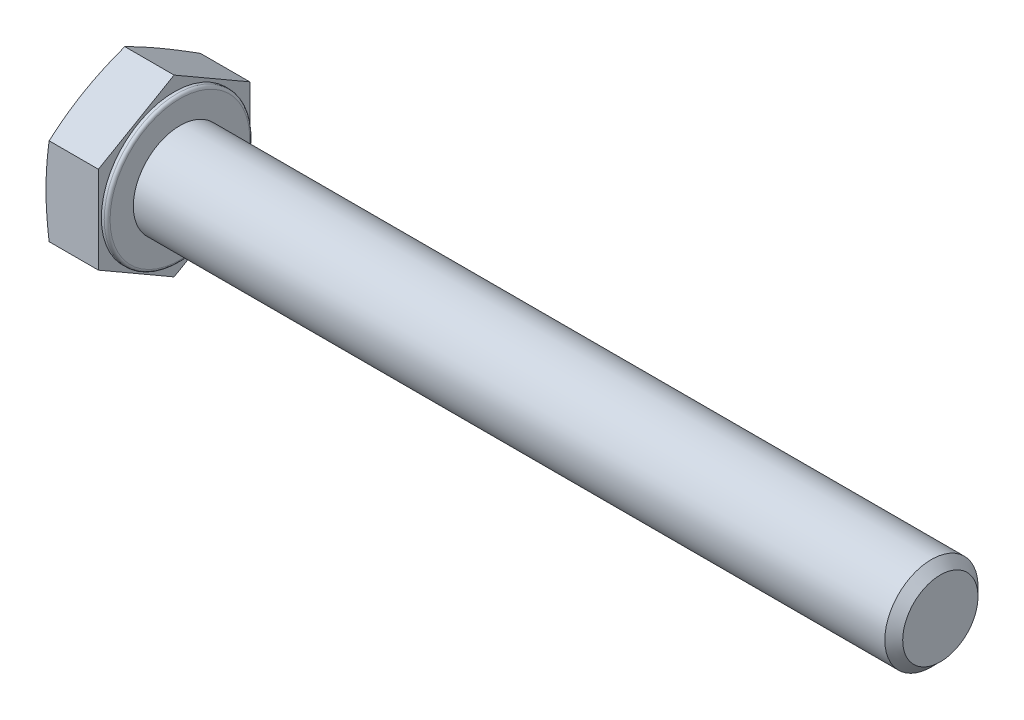
ISO-10303-21;
HEADER;
FILE_DESCRIPTION(('STEP AP214'),'2;1');
FILE_NAME('part.step','',(''),(''),'','','');
FILE_SCHEMA(('AUTOMOTIVE_DESIGN { 1 0 10303 214 1 1 1 1 }'));
ENDSEC;
DATA;
#1=APPLICATION_CONTEXT('core data for automotive mechanical design processes');
#2=APPLICATION_PROTOCOL_DEFINITION('international standard','automotive_design',2000,#1);
#3=PRODUCT_CONTEXT('',#1,'mechanical');
#4=PRODUCT('Part','Part','',(#3));
#5=PRODUCT_RELATED_PRODUCT_CATEGORY('part','',(#4));
#6=PRODUCT_DEFINITION_FORMATION('','',#4);
#7=PRODUCT_DEFINITION_CONTEXT('part definition',#1,'design');
#8=PRODUCT_DEFINITION('design','',#6,#7);
#9=PRODUCT_DEFINITION_SHAPE('','',#8);
#10=(LENGTH_UNIT() NAMED_UNIT(*) SI_UNIT(.MILLI.,.METRE.));
#11=(NAMED_UNIT(*) PLANE_ANGLE_UNIT() SI_UNIT($,.RADIAN.));
#12=(NAMED_UNIT(*) SI_UNIT($,.STERADIAN.) SOLID_ANGLE_UNIT());
#13=UNCERTAINTY_MEASURE_WITH_UNIT(LENGTH_MEASURE(1.E-05),#10,'distance_accuracy_value','');
#14=(GEOMETRIC_REPRESENTATION_CONTEXT(3) GLOBAL_UNCERTAINTY_ASSIGNED_CONTEXT((#13)) GLOBAL_UNIT_ASSIGNED_CONTEXT((#10,
#11,#12)) REPRESENTATION_CONTEXT('',''));
#15=CARTESIAN_POINT('',(0.,0.,0.));
#16=DIRECTION('',(0.,0.,1.));
#17=DIRECTION('',(1.,0.,0.));
#18=AXIS2_PLACEMENT_3D('',#15,#16,#17);
#19=CARTESIAN_POINT('',(4.49999999999999,7.8,0.));
#20=DIRECTION('',(-1.,0.,0.));
#21=DIRECTION('',(0.,0.,1.));
#22=AXIS2_PLACEMENT_3D('',#19,#20,#21);
#23=PLANE('',#22);
#24=DIRECTION('',(0.,0.5,0.866025403784439));
#25=VECTOR('',#24,1.);
#26=CARTESIAN_POINT('',(4.5,3.75277674973257,-6.5));
#27=LINE('',#26,#25);
#28=CARTESIAN_POINT('',(4.5,3.75277674973257,-6.5));
#29=VERTEX_POINT('',#28);
#30=CARTESIAN_POINT('',(4.49999999999999,7.50555349946513,0.));
#31=VERTEX_POINT('',#30);
#32=EDGE_CURVE('E132',#29,#31,#27,.T.);
#33=ORIENTED_EDGE('',*,*,#32,.T.);
#34=DIRECTION('',(0.,-0.5,0.866025403784439));
#35=VECTOR('',#34,1.);
#36=CARTESIAN_POINT('',(4.5,7.50555349946513,0.));
#37=LINE('',#36,#35);
#38=CARTESIAN_POINT('',(4.5,3.75277674973257,6.5));
#39=VERTEX_POINT('',#38);
#40=EDGE_CURVE('E63',#31,#39,#37,.T.);
#41=ORIENTED_EDGE('',*,*,#40,.T.);
#42=DIRECTION('',(0.,-1.,0.));
#43=VECTOR('',#42,1.);
#44=CARTESIAN_POINT('',(4.5,3.75277674973257,6.5));
#45=LINE('',#44,#43);
#46=CARTESIAN_POINT('',(4.5,-3.75277674973257,6.5));
#47=VERTEX_POINT('',#46);
#48=EDGE_CURVE('E121',#39,#47,#45,.T.);
#49=ORIENTED_EDGE('',*,*,#48,.T.);
#50=DIRECTION('',(0.,-0.5,-0.866025403784439));
#51=VECTOR('',#50,1.);
#52=CARTESIAN_POINT('',(4.5,-3.75277674973257,6.5));
#53=LINE('',#52,#51);
#54=CARTESIAN_POINT('',(4.5,-7.50555349946513,0.));
#55=VERTEX_POINT('',#54);
#56=EDGE_CURVE('E127',#47,#55,#53,.T.);
#57=ORIENTED_EDGE('',*,*,#56,.T.);
#58=DIRECTION('',(0.,0.5,-0.866025403784439));
#59=VECTOR('',#58,1.);
#60=CARTESIAN_POINT('',(4.5,-7.50555349946513,0.));
#61=LINE('',#60,#59);
#62=CARTESIAN_POINT('',(4.5,-3.75277674973257,-6.5));
#63=VERTEX_POINT('',#62);
#64=EDGE_CURVE('E136',#55,#63,#61,.T.);
#65=ORIENTED_EDGE('',*,*,#64,.T.);
#66=DIRECTION('',(0.,1.,0.));
#67=VECTOR('',#66,1.);
#68=CARTESIAN_POINT('',(4.5,-3.75277674973257,-6.5));
#69=LINE('',#68,#67);
#70=EDGE_CURVE('E139',#63,#29,#69,.T.);
#71=ORIENTED_EDGE('',*,*,#70,.T.);
#72=EDGE_LOOP('',(#33,#41,#49,#57,#65,#71));
#73=FACE_BOUND('',#72,.T.);
#74=CARTESIAN_POINT('',(4.49999999999999,0.,0.));
#75=DIRECTION('',(-1.,0.,0.));
#76=DIRECTION('',(0.,0.,1.));
#77=AXIS2_PLACEMENT_3D('',#74,#75,#76);
#78=CIRCLE('',#77,6.25);
#79=CARTESIAN_POINT('',(4.49999999999999,0.,6.25));
#80=VERTEX_POINT('',#79);
#81=EDGE_CURVE('E451',#80,#80,#78,.T.);
#82=ORIENTED_EDGE('',*,*,#81,.T.);
#83=EDGE_LOOP('',(#82));
#84=FACE_BOUND('',#83,.T.);
#85=ADVANCED_FACE('F39',(#73,#84),#23,.F.);
#86=CARTESIAN_POINT('',(70.3,0.,0.));
#87=DIRECTION('',(-1.,0.,0.));
#88=DIRECTION('',(0.,0.,1.));
#89=AXIS2_PLACEMENT_3D('',#86,#87,#88);
#90=CYLINDRICAL_SURFACE('',#89,6.25);
#91=ORIENTED_EDGE('',*,*,#81,.F.);
#92=EDGE_LOOP('',(#91));
#93=FACE_BOUND('',#92,.T.);
#94=CARTESIAN_POINT('',(4.74999999999999,0.,0.));
#95=DIRECTION('',(-1.,0.,0.));
#96=DIRECTION('',(0.,0.,1.));
#97=AXIS2_PLACEMENT_3D('',#94,#95,#96);
#98=CIRCLE('',#97,6.25);
#99=CARTESIAN_POINT('',(4.74999999999999,0.,6.25));
#100=VERTEX_POINT('',#99);
#101=EDGE_CURVE('E453',#100,#100,#98,.T.);
#102=ORIENTED_EDGE('',*,*,#101,.T.);
#103=EDGE_LOOP('',(#102));
#104=FACE_BOUND('',#103,.T.);
#105=ADVANCED_FACE('F236',(#93,#104),#90,.T.);
#106=CARTESIAN_POINT('',(4.74999999999999,0.,0.));
#107=DIRECTION('',(-1.,0.,0.));
#108=DIRECTION('',(0.,0.,1.));
#109=AXIS2_PLACEMENT_3D('',#106,#107,#108);
#110=TOROIDAL_SURFACE('',#109,6.,0.250000000000001);
#111=ORIENTED_EDGE('',*,*,#101,.F.);
#112=EDGE_LOOP('',(#111));
#113=FACE_BOUND('',#112,.T.);
#114=CARTESIAN_POINT('',(4.99999999999999,0.,0.));
#115=DIRECTION('',(-1.,0.,0.));
#116=DIRECTION('',(0.,0.,1.));
#117=AXIS2_PLACEMENT_3D('',#114,#115,#116);
#118=CIRCLE('',#117,6.);
#119=CARTESIAN_POINT('',(4.99999999999999,0.,6.));
#120=VERTEX_POINT('',#119);
#121=EDGE_CURVE('E456',#120,#120,#118,.T.);
#122=ORIENTED_EDGE('',*,*,#121,.T.);
#123=EDGE_LOOP('',(#122));
#124=FACE_BOUND('',#123,.T.);
#125=ADVANCED_FACE('F232',(#113,#124),#110,.T.);
#126=CARTESIAN_POINT('',(4.99999999999999,6.,0.));
#127=DIRECTION('',(-1.,0.,0.));
#128=DIRECTION('',(0.,0.,1.));
#129=AXIS2_PLACEMENT_3D('',#126,#127,#128);
#130=PLANE('',#129);
#131=ORIENTED_EDGE('',*,*,#121,.F.);
#132=EDGE_LOOP('',(#131));
#133=FACE_BOUND('',#132,.T.);
#134=CARTESIAN_POINT('',(4.99999999999999,0.,0.));
#135=DIRECTION('',(-1.,0.,0.));
#136=DIRECTION('',(0.,0.,1.));
#137=AXIS2_PLACEMENT_3D('',#134,#135,#136);
#138=CIRCLE('',#137,4.);
#139=CARTESIAN_POINT('',(4.99999999999999,0.,4.));
#140=VERTEX_POINT('',#139);
#141=EDGE_CURVE('E461',#140,#140,#138,.T.);
#142=ORIENTED_EDGE('',*,*,#141,.T.);
#143=EDGE_LOOP('',(#142));
#144=FACE_BOUND('',#143,.T.);
#145=ADVANCED_FACE('F228',(#133,#144),#130,.F.);
#146=CARTESIAN_POINT('',(70.3,0.,0.));
#147=DIRECTION('',(-1.,0.,0.));
#148=DIRECTION('',(0.,0.,1.));
#149=AXIS2_PLACEMENT_3D('',#146,#147,#148);
#150=CYLINDRICAL_SURFACE('',#149,4.);
#151=ORIENTED_EDGE('',*,*,#141,.F.);
#152=EDGE_LOOP('',(#151));
#153=FACE_BOUND('',#152,.T.);
#154=CARTESIAN_POINT('',(69.533,0.,0.));
#155=DIRECTION('',(-1.,0.,0.));
#156=DIRECTION('',(0.,0.,1.));
#157=AXIS2_PLACEMENT_3D('',#154,#155,#156);
#158=CIRCLE('',#157,4.);
#159=CARTESIAN_POINT('',(69.533,0.,4.));
#160=VERTEX_POINT('',#159);
#161=EDGE_CURVE('E449',#160,#160,#158,.T.);
#162=ORIENTED_EDGE('',*,*,#161,.T.);
#163=EDGE_LOOP('',(#162));
#164=FACE_BOUND('',#163,.T.);
#165=ADVANCED_FACE('F224',(#153,#164),#150,.T.);
#166=CARTESIAN_POINT('',(70.3,0.,0.));
#167=DIRECTION('',(-1.,0.,0.));
#168=DIRECTION('',(0.,0.,1.));
#169=AXIS2_PLACEMENT_3D('',#166,#167,#168);
#170=CONICAL_SURFACE('',#169,3.233,0.785398163397455);
#171=ORIENTED_EDGE('',*,*,#161,.F.);
#172=EDGE_LOOP('',(#171));
#173=FACE_BOUND('',#172,.T.);
#174=CARTESIAN_POINT('',(70.3,0.,0.));
#175=DIRECTION('',(-1.,0.,0.));
#176=DIRECTION('',(0.,0.,1.));
#177=AXIS2_PLACEMENT_3D('',#174,#175,#176);
#178=CIRCLE('',#177,3.233);
#179=CARTESIAN_POINT('',(70.3,0.,3.233));
#180=VERTEX_POINT('',#179);
#181=EDGE_CURVE('E447',#180,#180,#178,.T.);
#182=ORIENTED_EDGE('',*,*,#181,.T.);
#183=EDGE_LOOP('',(#182));
#184=FACE_BOUND('',#183,.T.);
#185=ADVANCED_FACE('F220',(#173,#184),#170,.T.);
#186=CARTESIAN_POINT('',(70.3,3.233,0.));
#187=DIRECTION('',(-1.,0.,0.));
#188=DIRECTION('',(0.,0.,1.));
#189=AXIS2_PLACEMENT_3D('',#186,#187,#188);
#190=PLANE('',#189);
#191=ORIENTED_EDGE('',*,*,#181,.F.);
#192=EDGE_LOOP('',(#191));
#193=FACE_BOUND('',#192,.T.);
#194=ADVANCED_FACE('F217',(#193),#190,.F.);
#195=CARTESIAN_POINT('',(4.5,7.50555349946513,0.));
#196=DIRECTION('',(0.,-0.866025403784439,-0.5));
#197=DIRECTION('',(0.,0.5,-0.866025403784439));
#198=AXIS2_PLACEMENT_3D('',#195,#196,#197);
#199=PLANE('',#198);
#200=DIRECTION('',(-1.,0.,0.));
#201=VECTOR('',#200,1.);
#202=CARTESIAN_POINT('',(4.5,3.75277674973257,6.5));
#203=LINE('',#202,#201);
#204=CARTESIAN_POINT('',(0.26943724812797,3.75277674973257,6.5));
#205=VERTEX_POINT('',#204);
#206=EDGE_CURVE('E110',#39,#205,#203,.T.);
#207=ORIENTED_EDGE('',*,*,#206,.F.);
#208=ORIENTED_EDGE('',*,*,#40,.F.);
#209=DIRECTION('',(-1.,0.,0.));
#210=VECTOR('',#209,1.);
#211=CARTESIAN_POINT('',(4.5,7.50555349946513,0.));
#212=LINE('',#211,#210);
#213=CARTESIAN_POINT('',(0.26943724812797,7.50555349946513,0.));
#214=VERTEX_POINT('',#213);
#215=EDGE_CURVE('E142',#31,#214,#212,.T.);
#216=ORIENTED_EDGE('',*,*,#215,.T.);
#217=CARTESIAN_POINT('',(0.269468188949637,3.75266127967873,6.5002));
#218=CARTESIAN_POINT('',(0.227689786895018,3.90851423871768,6.23025475643459));
#219=CARTESIAN_POINT('',(0.189761881028522,4.06464977836662,5.95982006889544));
#220=CARTESIAN_POINT('',(0.123126093519188,4.37747226630247,5.41799562604044));
#221=CARTESIAN_POINT('',(0.0944219569274198,4.53415941251653,5.14660552790472));
#222=CARTESIAN_POINT('',(0.0479094472750829,4.84713511167572,4.60451571542661));
#223=CARTESIAN_POINT('',(0.0300456056743191,5.00342154824672,4.33381966675176));
#224=CARTESIAN_POINT('',(0.00609202106019498,5.31619372769604,3.79208236075147));
#225=CARTESIAN_POINT('',(0.,5.47267942614745,3.52104118037574));
#226=CARTESIAN_POINT('',(0.,5.78565082305026,2.97895881962426));
#227=CARTESIAN_POINT('',(0.00609202106019492,5.94213652150166,2.70791763924853));
#228=CARTESIAN_POINT('',(0.030045605674319,6.25490870095099,2.16618033324825));
#229=CARTESIAN_POINT('',(0.0479094472750828,6.41119513752198,1.89548428457339));
#230=CARTESIAN_POINT('',(0.0944219569274197,6.72417083668118,1.35339447209528));
#231=CARTESIAN_POINT('',(0.123126093519188,6.88085798289523,1.08200437395956));
#232=CARTESIAN_POINT('',(0.189761881028522,7.19368047083108,0.540179931104565));
#233=CARTESIAN_POINT('',(0.227689786895017,7.34981601048003,0.269745243565408));
#234=CARTESIAN_POINT('',(0.269468188949637,7.50566896951897,-0.000199999999999693));
#235=B_SPLINE_CURVE_WITH_KNOTS('',3,(#217,#218,#219,#220,#221,#222,#223,#224,#225,#226,#227,
#228,#229,#230,#231,#232,#233,#234),.UNSPECIFIED.,.F.,.F.,(4,2,2,2,2,2,2,2,4),(0.,
0.943529232034515,1.88744107483688,2.82648138276556,3.76533995226988,4.70419852177419,
5.64323882970287,6.58715067250524,7.53067990453975),.UNSPECIFIED.);
#236=CARTESIAN_POINT('',(0.,5.62916512459885,3.25));
#237=VERTEX_POINT('',#236);
#238=EDGE_CURVE('E206',#237,#214,#235,.T.);
#239=ORIENTED_EDGE('',*,*,#238,.F.);
#240=EDGE_CURVE('E114',#205,#237,#235,.T.);
#241=ORIENTED_EDGE('',*,*,#240,.F.);
#242=EDGE_LOOP('',(#207,#208,#216,#239,#241));
#243=FACE_BOUND('',#242,.T.);
#244=ADVANCED_FACE('F112',(#243),#199,.F.);
#245=CARTESIAN_POINT('',(4.5,3.75277674973257,6.5));
#246=DIRECTION('',(0.,0.,-1.));
#247=DIRECTION('',(-1.,0.,0.));
#248=AXIS2_PLACEMENT_3D('',#245,#246,#247);
#249=PLANE('',#248);
#250=DIRECTION('',(-1.,0.,0.));
#251=VECTOR('',#250,1.);
#252=CARTESIAN_POINT('',(4.5,-3.75277674973257,6.5));
#253=LINE('',#252,#251);
#254=CARTESIAN_POINT('',(0.26943724812797,-3.75277674973257,6.5));
#255=VERTEX_POINT('',#254);
#256=EDGE_CURVE('E118',#47,#255,#253,.T.);
#257=ORIENTED_EDGE('',*,*,#256,.F.);
#258=ORIENTED_EDGE('',*,*,#48,.F.);
#259=ORIENTED_EDGE('',*,*,#206,.T.);
#260=CARTESIAN_POINT('',(1.43784813571386,-9.92747995942932,6.5));
#261=CARTESIAN_POINT('',(1.37176044607534,-9.63259364027998,6.5));
#262=CARTESIAN_POINT('',(1.30648101190795,-9.3375228790065,6.5));
#263=CARTESIAN_POINT('',(1.17797493100926,-8.74692189012471,6.5));
#264=CARTESIAN_POINT('',(1.1147483729357,-8.45139164324858,6.5));
#265=CARTESIAN_POINT('',(0.990729298823789,-7.85951636714962,6.5));
#266=CARTESIAN_POINT('',(0.929939231295713,-7.56317082304419,6.5));
#267=CARTESIAN_POINT('',(0.811449301164637,-6.96986292000732,6.5));
#268=CARTESIAN_POINT('',(0.753749412480938,-6.67290056630365,6.5));
#269=CARTESIAN_POINT('',(0.642620385559351,-6.08062010164735,6.5));
#270=CARTESIAN_POINT('',(0.589160917961816,-5.78530770946897,6.5));
#271=CARTESIAN_POINT('',(0.486909258203032,-5.19387740306857,6.5));
#272=CARTESIAN_POINT('',(0.438116963343878,-4.89775950671863,6.5));
#273=CARTESIAN_POINT('',(0.346298254295136,-4.30466070819224,6.5));
#274=CARTESIAN_POINT('',(0.303271130290397,-4.00767991686507,6.5));
#275=CARTESIAN_POINT('',(0.224250701875666,-3.4127732827379,6.5));
#276=CARTESIAN_POINT('',(0.188257404055355,-3.1148474390528,6.5));
#277=CARTESIAN_POINT('',(0.124323829115841,-2.51468954348012,6.5));
#278=CARTESIAN_POINT('',(0.0964798780072207,-2.21244707560578,6.5));
#279=CARTESIAN_POINT('',(0.0507658275086469,-1.60720229766205,6.5));
#280=CARTESIAN_POINT('',(0.0328954993834365,-1.30420000517859,6.5));
#281=CARTESIAN_POINT('',(0.00817096446973431,-0.697875110667414,6.5));
#282=CARTESIAN_POINT('',(0.00131175154307772,-0.394552716974275,6.5));
#283=CARTESIAN_POINT('',(-0.000968834974519462,0.212135691107176,6.5));
#284=CARTESIAN_POINT('',(0.00360978157467533,0.51550170545766,6.5));
#285=CARTESIAN_POINT('',(0.0239473685237663,1.12295501106408,6.5));
#286=CARTESIAN_POINT('',(0.0397469168421473,1.42704091600701,6.5));
#287=CARTESIAN_POINT('',(0.0816245049781679,2.03449758673866,6.5));
#288=CARTESIAN_POINT('',(0.107702772356124,2.33786833654499,6.5));
#289=CARTESIAN_POINT('',(0.168820504082469,2.94389214539338,6.5));
#290=CARTESIAN_POINT('',(0.203865816554221,3.24654460547712,6.5));
#291=CARTESIAN_POINT('',(0.281459381215648,3.85087551166636,6.5));
#292=CARTESIAN_POINT('',(0.324007656961857,4.15255395471078,6.5));
#293=CARTESIAN_POINT('',(0.412225361056411,4.73502363900967,6.5));
#294=CARTESIAN_POINT('',(0.457501487645549,5.01587505465996,6.5));
#295=CARTESIAN_POINT('',(0.552448562565194,5.57683763977975,6.5));
#296=CARTESIAN_POINT('',(0.602119630799358,5.85694878883832,6.5));
#297=CARTESIAN_POINT('',(0.705052527737279,6.41653333043442,6.5));
#298=CARTESIAN_POINT('',(0.75831467822402,6.69600666349383,6.5));
#299=CARTESIAN_POINT('',(0.867774180949243,7.25437933209811,6.5));
#300=CARTESIAN_POINT('',(0.923971571217232,7.53327866015738,6.5));
#301=CARTESIAN_POINT('',(1.09616917202687,8.36936246055762,6.5));
#302=CARTESIAN_POINT('',(1.21575141849974,8.92580841919927,6.5));
#303=CARTESIAN_POINT('',(1.46138948338771,10.037220527486,6.5));
#304=CARTESIAN_POINT('',(1.58744492312537,10.5921867617006,6.5));
#305=CARTESIAN_POINT('',(1.84285510364484,11.6956125673175,6.5));
#306=CARTESIAN_POINT('',(1.97216525218087,12.2440824890452,6.5));
#307=CARTESIAN_POINT('',(2.23402288841482,13.3402571674654,6.5));
#308=CARTESIAN_POINT('',(2.36657043508951,13.887961910026,6.5));
#309=CARTESIAN_POINT('',(2.63389242751176,14.9821103075548,6.5));
#310=CARTESIAN_POINT('',(2.76866392335456,15.528554684682,6.5));
#311=CARTESIAN_POINT('',(3.04004719024968,16.6209674516511,6.5));
#312=CARTESIAN_POINT('',(3.17665890042425,17.166935856606,6.5));
#313=CARTESIAN_POINT('',(3.31392230844987,17.7127383693738,6.5));
#314=B_SPLINE_CURVE_WITH_KNOTS('',3,(#260,#261,#262,#263,#264,#265,#266,#267,#268,#269,#270,
#271,#272,#273,#274,#275,#276,#277,#278,#279,#280,#281,#282,#283,#284,#285,#286,#287,#288,#289,
#290,#291,#292,#293,#294,#295,#296,#297,#298,#299,#300,#301,#302,#303,#304,#305,#306,#307,#308,
#309,#310,#311,#312,#313),.UNSPECIFIED.,.F.,.F.,(4,2,2,2,2,2,2,2,2,2,2,2,2,2,2,2,2,2,2,2,2,2,2,
2,2,2,4),(0.,0.906607084598815,1.8132532709792,2.72078883058254,3.62831672949855,
4.52862337467704,5.42891020467153,6.32908608815495,7.2292628149694,8.13968571853475,
9.05008774158607,9.96007573841703,10.8700629508024,11.7833577896006,12.6966728489474,
13.6105850787011,14.5245001778528,15.3778915312334,16.2313061741867,17.084797390217,
17.9382996669808,19.6456836970312,21.3529679597985,23.0434756712189,24.7340142022029,
26.4224665598404,28.1108631968051),.UNSPECIFIED.);
#315=CARTESIAN_POINT('',(0.,0.,6.5));
#316=VERTEX_POINT('',#315);
#317=EDGE_CURVE('E200',#316,#205,#314,.T.);
#318=ORIENTED_EDGE('',*,*,#317,.F.);
#319=EDGE_CURVE('E205',#255,#316,#314,.T.);
#320=ORIENTED_EDGE('',*,*,#319,.F.);
#321=EDGE_LOOP('',(#257,#258,#259,#318,#320));
#322=FACE_BOUND('',#321,.T.);
#323=ADVANCED_FACE('F122',(#322),#249,.F.);
#324=CARTESIAN_POINT('',(4.5,-3.75277674973257,6.5));
#325=DIRECTION('',(0.,0.866025403784439,-0.5));
#326=DIRECTION('',(0.,0.5,0.866025403784439));
#327=AXIS2_PLACEMENT_3D('',#324,#325,#326);
#328=PLANE('',#327);
#329=DIRECTION('',(-1.,0.,0.));
#330=VECTOR('',#329,1.);
#331=CARTESIAN_POINT('',(4.5,-7.50555349946513,0.));
#332=LINE('',#331,#330);
#333=CARTESIAN_POINT('',(0.26943724812797,-7.50555349946513,0.));
#334=VERTEX_POINT('',#333);
#335=EDGE_CURVE('E148',#55,#334,#332,.T.);
#336=ORIENTED_EDGE('',*,*,#335,.F.);
#337=ORIENTED_EDGE('',*,*,#56,.F.);
#338=ORIENTED_EDGE('',*,*,#256,.T.);
#339=CARTESIAN_POINT('',(0.269468188949637,-7.50566896951897,-0.0002));
#340=CARTESIAN_POINT('',(0.227689786895017,-7.34981601048003,0.269745243565409));
#341=CARTESIAN_POINT('',(0.189761881028522,-7.19368047083108,0.540179931104566));
#342=CARTESIAN_POINT('',(0.123126093519188,-6.88085798289523,1.08200437395956));
#343=CARTESIAN_POINT('',(0.0944219569274196,-6.72417083668117,1.35339447209528));
#344=CARTESIAN_POINT('',(0.0479094472750826,-6.41119513752198,1.89548428457339));
#345=CARTESIAN_POINT('',(0.0300456056743188,-6.25490870095099,2.16618033324825));
#346=CARTESIAN_POINT('',(0.00609202106019463,-5.94213652150166,2.70791763924853));
#347=CARTESIAN_POINT('',(0.,-5.78565082305026,2.97895881962427));
#348=CARTESIAN_POINT('',(0.,-5.47267942614745,3.52104118037574));
#349=CARTESIAN_POINT('',(0.00609202106019497,-5.31619372769604,3.79208236075147));
#350=CARTESIAN_POINT('',(0.0300456056743193,-5.00342154824672,4.33381966675176));
#351=CARTESIAN_POINT('',(0.047909447275083,-4.84713511167572,4.60451571542661));
#352=CARTESIAN_POINT('',(0.0944219569274199,-4.53415941251653,5.14660552790473));
#353=CARTESIAN_POINT('',(0.123126093519188,-4.37747226630247,5.41799562604044));
#354=CARTESIAN_POINT('',(0.189761881028522,-4.06464977836662,5.95982006889544));
#355=CARTESIAN_POINT('',(0.227689786895018,-3.90851423871768,6.23025475643459));
#356=CARTESIAN_POINT('',(0.269468188949638,-3.75266127967873,6.5002));
#357=B_SPLINE_CURVE_WITH_KNOTS('',3,(#339,#340,#341,#342,#343,#344,#345,#346,#347,#348,#349,
#350,#351,#352,#353,#354,#355,#356),.UNSPECIFIED.,.F.,.F.,(4,2,2,2,2,2,2,2,4),(0.,
0.943529232034516,1.88744107483688,2.82648138276556,3.76533995226988,4.70419852177419,
5.64323882970288,6.58715067250524,7.53067990453975),.UNSPECIFIED.);
#358=CARTESIAN_POINT('',(0.,-5.62916512459885,3.25));
#359=VERTEX_POINT('',#358);
#360=EDGE_CURVE('E193',#359,#255,#357,.T.);
#361=ORIENTED_EDGE('',*,*,#360,.F.);
#362=EDGE_CURVE('E199',#334,#359,#357,.T.);
#363=ORIENTED_EDGE('',*,*,#362,.F.);
#364=EDGE_LOOP('',(#336,#337,#338,#361,#363));
#365=FACE_BOUND('',#364,.T.);
#366=ADVANCED_FACE('F181',(#365),#328,.F.);
#367=CARTESIAN_POINT('',(4.5,-7.50555349946513,0.));
#368=DIRECTION('',(0.,0.866025403784439,0.5));
#369=DIRECTION('',(0.,-0.5,0.866025403784439));
#370=AXIS2_PLACEMENT_3D('',#367,#368,#369);
#371=PLANE('',#370);
#372=DIRECTION('',(-1.,0.,0.));
#373=VECTOR('',#372,1.);
#374=CARTESIAN_POINT('',(4.5,-3.75277674973257,-6.5));
#375=LINE('',#374,#373);
#376=CARTESIAN_POINT('',(0.26943724812797,-3.75277674973257,-6.5));
#377=VERTEX_POINT('',#376);
#378=EDGE_CURVE('E145',#63,#377,#375,.T.);
#379=ORIENTED_EDGE('',*,*,#378,.F.);
#380=ORIENTED_EDGE('',*,*,#64,.F.);
#381=ORIENTED_EDGE('',*,*,#335,.T.);
#382=CARTESIAN_POINT('',(0.269468188949637,-3.75266127967873,-6.5002));
#383=CARTESIAN_POINT('',(0.227689786895018,-3.90851423871768,-6.23025475643459));
#384=CARTESIAN_POINT('',(0.189761881028522,-4.06464977836662,-5.95982006889544));
#385=CARTESIAN_POINT('',(0.123126093519188,-4.37747226630247,-5.41799562604044));
#386=CARTESIAN_POINT('',(0.0944219569274198,-4.53415941251653,-5.14660552790472));
#387=CARTESIAN_POINT('',(0.0479094472750829,-4.84713511167572,-4.60451571542661));
#388=CARTESIAN_POINT('',(0.0300456056743191,-5.00342154824672,-4.33381966675176));
#389=CARTESIAN_POINT('',(0.00609202106019498,-5.31619372769604,-3.79208236075147));
#390=CARTESIAN_POINT('',(0.,-5.47267942614745,-3.52104118037574));
#391=CARTESIAN_POINT('',(0.,-5.78565082305026,-2.97895881962426));
#392=CARTESIAN_POINT('',(0.00609202106019492,-5.94213652150166,-2.70791763924853));
#393=CARTESIAN_POINT('',(0.030045605674319,-6.25490870095099,-2.16618033324825));
#394=CARTESIAN_POINT('',(0.0479094472750828,-6.41119513752198,-1.89548428457339));
#395=CARTESIAN_POINT('',(0.0944219569274197,-6.72417083668118,-1.35339447209528));
#396=CARTESIAN_POINT('',(0.123126093519188,-6.88085798289523,-1.08200437395956));
#397=CARTESIAN_POINT('',(0.189761881028522,-7.19368047083108,-0.540179931104565));
#398=CARTESIAN_POINT('',(0.227689786895017,-7.34981601048003,-0.269745243565408));
#399=CARTESIAN_POINT('',(0.269468188949637,-7.50566896951897,0.000199999999999693));
#400=B_SPLINE_CURVE_WITH_KNOTS('',3,(#382,#383,#384,#385,#386,#387,#388,#389,#390,#391,#392,
#393,#394,#395,#396,#397,#398,#399),.UNSPECIFIED.,.F.,.F.,(4,2,2,2,2,2,2,2,4),(0.,
0.943529232034515,1.88744107483688,2.82648138276556,3.76533995226988,4.70419852177419,
5.64323882970287,6.58715067250524,7.53067990453975),.UNSPECIFIED.);
#401=CARTESIAN_POINT('',(0.,-5.62916512459885,-3.25));
#402=VERTEX_POINT('',#401);
#403=EDGE_CURVE('E185',#402,#334,#400,.T.);
#404=ORIENTED_EDGE('',*,*,#403,.F.);
#405=EDGE_CURVE('E191',#377,#402,#400,.T.);
#406=ORIENTED_EDGE('',*,*,#405,.F.);
#407=EDGE_LOOP('',(#379,#380,#381,#404,#406));
#408=FACE_BOUND('',#407,.T.);
#409=ADVANCED_FACE('F176',(#408),#371,.F.);
#410=CARTESIAN_POINT('',(4.5,-3.75277674973257,-6.5));
#411=DIRECTION('',(0.,0.,1.));
#412=DIRECTION('',(1.,0.,0.));
#413=AXIS2_PLACEMENT_3D('',#410,#411,#412);
#414=PLANE('',#413);
#415=DIRECTION('',(-1.,0.,0.));
#416=VECTOR('',#415,1.);
#417=CARTESIAN_POINT('',(4.5,3.75277674973257,-6.5));
#418=LINE('',#417,#416);
#419=CARTESIAN_POINT('',(0.26943724812797,3.75277674973257,-6.5));
#420=VERTEX_POINT('',#419);
#421=EDGE_CURVE('E55',#29,#420,#418,.T.);
#422=ORIENTED_EDGE('',*,*,#421,.F.);
#423=ORIENTED_EDGE('',*,*,#70,.F.);
#424=ORIENTED_EDGE('',*,*,#378,.T.);
#425=CARTESIAN_POINT('',(1.43784813571386,-9.92747995942932,-6.5));
#426=CARTESIAN_POINT('',(1.37176044607534,-9.63259364027998,-6.5));
#427=CARTESIAN_POINT('',(1.30648101190795,-9.3375228790065,-6.5));
#428=CARTESIAN_POINT('',(1.17797493100926,-8.74692189012471,-6.5));
#429=CARTESIAN_POINT('',(1.1147483729357,-8.45139164324858,-6.5));
#430=CARTESIAN_POINT('',(0.990729298823789,-7.85951636714962,-6.5));
#431=CARTESIAN_POINT('',(0.929939231295713,-7.56317082304419,-6.5));
#432=CARTESIAN_POINT('',(0.811449301164637,-6.96986292000732,-6.5));
#433=CARTESIAN_POINT('',(0.753749412480938,-6.67290056630365,-6.5));
#434=CARTESIAN_POINT('',(0.642620385559351,-6.08062010164735,-6.5));
#435=CARTESIAN_POINT('',(0.589160917961816,-5.78530770946897,-6.5));
#436=CARTESIAN_POINT('',(0.486909258203032,-5.19387740306857,-6.5));
#437=CARTESIAN_POINT('',(0.438116963343878,-4.89775950671863,-6.5));
#438=CARTESIAN_POINT('',(0.346298254295136,-4.30466070819224,-6.5));
#439=CARTESIAN_POINT('',(0.303271130290397,-4.00767991686507,-6.5));
#440=CARTESIAN_POINT('',(0.224250701875666,-3.4127732827379,-6.5));
#441=CARTESIAN_POINT('',(0.188257404055355,-3.1148474390528,-6.5));
#442=CARTESIAN_POINT('',(0.124323829115841,-2.51468954348012,-6.5));
#443=CARTESIAN_POINT('',(0.0964798780072207,-2.21244707560578,-6.5));
#444=CARTESIAN_POINT('',(0.0507658275086469,-1.60720229766205,-6.5));
#445=CARTESIAN_POINT('',(0.0328954993834365,-1.30420000517859,-6.5));
#446=CARTESIAN_POINT('',(0.00817096446973431,-0.697875110667414,-6.5));
#447=CARTESIAN_POINT('',(0.00131175154307772,-0.394552716974275,-6.5));
#448=CARTESIAN_POINT('',(-0.000968834974519462,0.212135691107176,-6.5));
#449=CARTESIAN_POINT('',(0.00360978157467533,0.51550170545766,-6.5));
#450=CARTESIAN_POINT('',(0.0239473685237663,1.12295501106408,-6.5));
#451=CARTESIAN_POINT('',(0.0397469168421473,1.42704091600701,-6.5));
#452=CARTESIAN_POINT('',(0.0816245049781679,2.03449758673866,-6.5));
#453=CARTESIAN_POINT('',(0.107702772356124,2.33786833654499,-6.5));
#454=CARTESIAN_POINT('',(0.168820504082469,2.94389214539338,-6.5));
#455=CARTESIAN_POINT('',(0.203865816554221,3.24654460547712,-6.5));
#456=CARTESIAN_POINT('',(0.281459381215648,3.85087551166636,-6.5));
#457=CARTESIAN_POINT('',(0.324007656961857,4.15255395471078,-6.5));
#458=CARTESIAN_POINT('',(0.412225361056411,4.73502363900967,-6.5));
#459=CARTESIAN_POINT('',(0.457501487645549,5.01587505465996,-6.5));
#460=CARTESIAN_POINT('',(0.552448562565194,5.57683763977975,-6.5));
#461=CARTESIAN_POINT('',(0.602119630799358,5.85694878883832,-6.5));
#462=CARTESIAN_POINT('',(0.705052527737279,6.41653333043442,-6.5));
#463=CARTESIAN_POINT('',(0.75831467822402,6.69600666349383,-6.5));
#464=CARTESIAN_POINT('',(0.867774180949243,7.25437933209811,-6.5));
#465=CARTESIAN_POINT('',(0.923971571217232,7.53327866015738,-6.5));
#466=CARTESIAN_POINT('',(1.09616917202687,8.36936246055762,-6.5));
#467=CARTESIAN_POINT('',(1.21575141849974,8.92580841919927,-6.5));
#468=CARTESIAN_POINT('',(1.46138948338771,10.037220527486,-6.5));
#469=CARTESIAN_POINT('',(1.58744492312537,10.5921867617006,-6.5));
#470=CARTESIAN_POINT('',(1.84285510364484,11.6956125673175,-6.5));
#471=CARTESIAN_POINT('',(1.97216525218087,12.2440824890452,-6.5));
#472=CARTESIAN_POINT('',(2.23402288841482,13.3402571674654,-6.5));
#473=CARTESIAN_POINT('',(2.36657043508951,13.887961910026,-6.5));
#474=CARTESIAN_POINT('',(2.63389242751176,14.9821103075548,-6.5));
#475=CARTESIAN_POINT('',(2.76866392335456,15.528554684682,-6.5));
#476=CARTESIAN_POINT('',(3.04004719024968,16.6209674516511,-6.5));
#477=CARTESIAN_POINT('',(3.17665890042425,17.166935856606,-6.5));
#478=CARTESIAN_POINT('',(3.31392230844987,17.7127383693738,-6.5));
#479=B_SPLINE_CURVE_WITH_KNOTS('',3,(#425,#426,#427,#428,#429,#430,#431,#432,#433,#434,#435,
#436,#437,#438,#439,#440,#441,#442,#443,#444,#445,#446,#447,#448,#449,#450,#451,#452,#453,#454,
#455,#456,#457,#458,#459,#460,#461,#462,#463,#464,#465,#466,#467,#468,#469,#470,#471,#472,#473,
#474,#475,#476,#477,#478),.UNSPECIFIED.,.F.,.F.,(4,2,2,2,2,2,2,2,2,2,2,2,2,2,2,2,2,2,2,2,2,2,2,
2,2,2,4),(0.,0.906607084598815,1.8132532709792,2.72078883058254,3.62831672949855,
4.52862337467704,5.42891020467153,6.32908608815495,7.2292628149694,8.13968571853475,
9.05008774158607,9.96007573841703,10.8700629508024,11.7833577896006,12.6966728489474,
13.6105850787011,14.5245001778528,15.3778915312334,16.2313061741867,17.084797390217,
17.9382996669808,19.6456836970312,21.3529679597985,23.0434756712189,24.7340142022029,
26.4224665598404,28.1108631968051),.UNSPECIFIED.);
#480=CARTESIAN_POINT('',(0.,0.,-6.5));
#481=VERTEX_POINT('',#480);
#482=EDGE_CURVE('E159',#481,#377,#479,.F.);
#483=ORIENTED_EDGE('',*,*,#482,.F.);
#484=EDGE_CURVE('E192',#420,#481,#479,.F.);
#485=ORIENTED_EDGE('',*,*,#484,.F.);
#486=EDGE_LOOP('',(#422,#423,#424,#483,#485));
#487=FACE_BOUND('',#486,.T.);
#488=ADVANCED_FACE('F172',(#487),#414,.F.);
#489=CARTESIAN_POINT('',(4.5,3.75277674973257,-6.5));
#490=DIRECTION('',(0.,-0.866025403784439,0.5));
#491=DIRECTION('',(0.,-0.5,-0.866025403784439));
#492=AXIS2_PLACEMENT_3D('',#489,#490,#491);
#493=PLANE('',#492);
#494=ORIENTED_EDGE('',*,*,#215,.F.);
#495=ORIENTED_EDGE('',*,*,#32,.F.);
#496=ORIENTED_EDGE('',*,*,#421,.T.);
#497=CARTESIAN_POINT('',(0.269468188949637,7.50566896951897,0.0002));
#498=CARTESIAN_POINT('',(0.227689786895017,7.34981601048003,-0.269745243565409));
#499=CARTESIAN_POINT('',(0.189761881028522,7.19368047083108,-0.540179931104566));
#500=CARTESIAN_POINT('',(0.123126093519188,6.88085798289523,-1.08200437395956));
#501=CARTESIAN_POINT('',(0.0944219569274196,6.72417083668117,-1.35339447209528));
#502=CARTESIAN_POINT('',(0.0479094472750826,6.41119513752198,-1.89548428457339));
#503=CARTESIAN_POINT('',(0.0300456056743188,6.25490870095099,-2.16618033324825));
#504=CARTESIAN_POINT('',(0.00609202106019463,5.94213652150166,-2.70791763924853));
#505=CARTESIAN_POINT('',(0.,5.78565082305026,-2.97895881962427));
#506=CARTESIAN_POINT('',(0.,5.47267942614745,-3.52104118037574));
#507=CARTESIAN_POINT('',(0.00609202106019497,5.31619372769604,-3.79208236075147));
#508=CARTESIAN_POINT('',(0.0300456056743193,5.00342154824672,-4.33381966675176));
#509=CARTESIAN_POINT('',(0.047909447275083,4.84713511167572,-4.60451571542661));
#510=CARTESIAN_POINT('',(0.0944219569274199,4.53415941251653,-5.14660552790473));
#511=CARTESIAN_POINT('',(0.123126093519188,4.37747226630247,-5.41799562604044));
#512=CARTESIAN_POINT('',(0.189761881028522,4.06464977836662,-5.95982006889544));
#513=CARTESIAN_POINT('',(0.227689786895018,3.90851423871768,-6.23025475643459));
#514=CARTESIAN_POINT('',(0.269468188949638,3.75266127967873,-6.5002));
#515=B_SPLINE_CURVE_WITH_KNOTS('',3,(#497,#498,#499,#500,#501,#502,#503,#504,#505,#506,#507,
#508,#509,#510,#511,#512,#513,#514),.UNSPECIFIED.,.F.,.F.,(4,2,2,2,2,2,2,2,4),(0.,
0.943529232034516,1.88744107483688,2.82648138276556,3.76533995226988,4.70419852177419,
5.64323882970288,6.58715067250524,7.53067990453975),.UNSPECIFIED.);
#516=CARTESIAN_POINT('',(0.,5.62916512459885,-3.25));
#517=VERTEX_POINT('',#516);
#518=EDGE_CURVE('E117',#517,#420,#515,.T.);
#519=ORIENTED_EDGE('',*,*,#518,.F.);
#520=EDGE_CURVE('E158',#214,#517,#515,.T.);
#521=ORIENTED_EDGE('',*,*,#520,.F.);
#522=EDGE_LOOP('',(#494,#495,#496,#519,#521));
#523=FACE_BOUND('',#522,.T.);
#524=ADVANCED_FACE('F168',(#523),#493,.F.);
#525=CARTESIAN_POINT('',(0.348333950160457,0.,0.));
#526=DIRECTION('',(1.,0.,0.));
#527=DIRECTION('',(0.,0.,-1.));
#528=AXIS2_PLACEMENT_3D('',#525,#526,#527);
#529=CONICAL_SURFACE('',#528,7.8,1.30899693899575);
#530=CARTESIAN_POINT('',(0.,0.,0.));
#531=DIRECTION('',(-1.,0.,0.));
#532=DIRECTION('',(0.,0.,1.));
#533=AXIS2_PLACEMENT_3D('',#530,#531,#532);
#534=CIRCLE('',#533,6.5);
#535=EDGE_CURVE('E48',#359,#316,#534,.T.);
#536=ORIENTED_EDGE('',*,*,#535,.F.);
#537=ORIENTED_EDGE('',*,*,#360,.T.);
#538=ORIENTED_EDGE('',*,*,#319,.T.);
#539=EDGE_LOOP('',(#536,#537,#538));
#540=FACE_BOUND('',#539,.T.);
#541=ADVANCED_FACE('F171',(#540),#529,.T.);
#542=ORIENTED_EDGE('',*,*,#403,.T.);
#543=ORIENTED_EDGE('',*,*,#362,.T.);
#544=EDGE_CURVE('E444',#402,#359,#534,.T.);
#545=ORIENTED_EDGE('',*,*,#544,.F.);
#546=EDGE_LOOP('',(#542,#543,#545));
#547=FACE_BOUND('',#546,.T.);
#548=ADVANCED_FACE('F303',(#547),#529,.T.);
#549=ORIENTED_EDGE('',*,*,#482,.T.);
#550=ORIENTED_EDGE('',*,*,#405,.T.);
#551=EDGE_CURVE('E438',#481,#402,#534,.T.);
#552=ORIENTED_EDGE('',*,*,#551,.F.);
#553=EDGE_LOOP('',(#549,#550,#552));
#554=FACE_BOUND('',#553,.T.);
#555=ADVANCED_FACE('F310',(#554),#529,.T.);
#556=EDGE_CURVE('E47',#237,#517,#534,.T.);
#557=ORIENTED_EDGE('',*,*,#556,.F.);
#558=ORIENTED_EDGE('',*,*,#238,.T.);
#559=ORIENTED_EDGE('',*,*,#520,.T.);
#560=EDGE_LOOP('',(#557,#558,#559));
#561=FACE_BOUND('',#560,.T.);
#562=ADVANCED_FACE('F317',(#561),#529,.T.);
#563=EDGE_CURVE('E11',#316,#237,#534,.T.);
#564=ORIENTED_EDGE('',*,*,#563,.F.);
#565=ORIENTED_EDGE('',*,*,#317,.T.);
#566=ORIENTED_EDGE('',*,*,#240,.T.);
#567=EDGE_LOOP('',(#564,#565,#566));
#568=FACE_BOUND('',#567,.T.);
#569=ADVANCED_FACE('F305',(#568),#529,.T.);
#570=CARTESIAN_POINT('',(0.,0.,0.));
#571=DIRECTION('',(1.,0.,0.));
#572=DIRECTION('',(0.,0.,-1.));
#573=AXIS2_PLACEMENT_3D('',#570,#571,#572);
#574=PLANE('',#573);
#575=ORIENTED_EDGE('',*,*,#563,.T.);
#576=ORIENTED_EDGE('',*,*,#556,.T.);
#577=EDGE_CURVE('E429',#517,#481,#534,.T.);
#578=ORIENTED_EDGE('',*,*,#577,.T.);
#579=ORIENTED_EDGE('',*,*,#551,.T.);
#580=ORIENTED_EDGE('',*,*,#544,.T.);
#581=ORIENTED_EDGE('',*,*,#535,.T.);
#582=EDGE_LOOP('',(#575,#576,#578,#579,#580,#581));
#583=FACE_BOUND('',#582,.T.);
#584=ADVANCED_FACE('F41',(#583),#574,.F.);
#585=ORIENTED_EDGE('',*,*,#518,.T.);
#586=ORIENTED_EDGE('',*,*,#484,.T.);
#587=ORIENTED_EDGE('',*,*,#577,.F.);
#588=EDGE_LOOP('',(#585,#586,#587));
#589=FACE_BOUND('',#588,.T.);
#590=ADVANCED_FACE('F165',(#589),#529,.T.);
#591=CLOSED_SHELL('',(#85,#105,#125,#145,#165,#185,#194,#244,#323,#366,#409,#488,#524,#541,#548,
#555,#562,#569,#584,#590));
#592=MANIFOLD_SOLID_BREP('B2',#591);
#593=ADVANCED_BREP_SHAPE_REPRESENTATION('',(#18,#592),#14);
#594=SHAPE_DEFINITION_REPRESENTATION(#9,#593);
ENDSEC;
END-ISO-10303-21;
